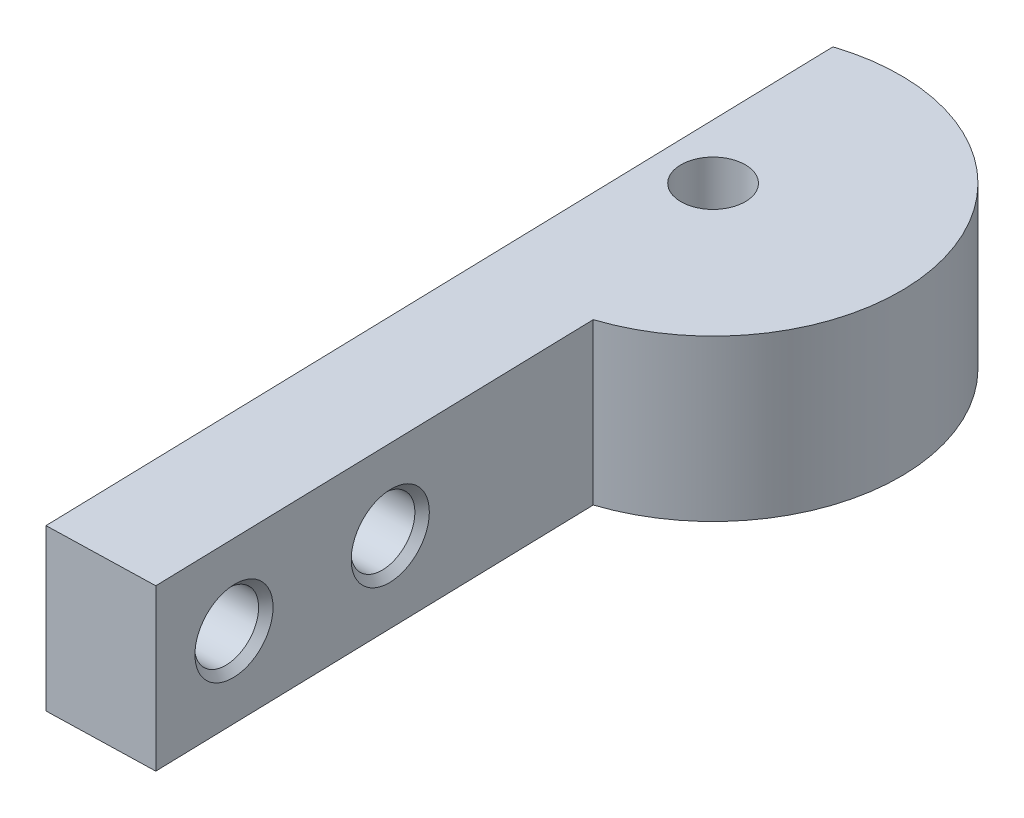
ISO-10303-21;
HEADER;
FILE_DESCRIPTION(('STEP AP214'),'2;1');
FILE_NAME('part.step','',(''),(''),'','','');
FILE_SCHEMA(('AUTOMOTIVE_DESIGN { 1 0 10303 214 1 1 1 1 }'));
ENDSEC;
DATA;
#1=APPLICATION_CONTEXT('core data for automotive mechanical design processes');
#2=APPLICATION_PROTOCOL_DEFINITION('international standard','automotive_design',2000,#1);
#3=PRODUCT_CONTEXT('',#1,'mechanical');
#4=PRODUCT('Part','Part','',(#3));
#5=PRODUCT_RELATED_PRODUCT_CATEGORY('part','',(#4));
#6=PRODUCT_DEFINITION_FORMATION('','',#4);
#7=PRODUCT_DEFINITION_CONTEXT('part definition',#1,'design');
#8=PRODUCT_DEFINITION('design','',#6,#7);
#9=PRODUCT_DEFINITION_SHAPE('','',#8);
#10=(LENGTH_UNIT() NAMED_UNIT(*) SI_UNIT(.MILLI.,.METRE.));
#11=(NAMED_UNIT(*) PLANE_ANGLE_UNIT() SI_UNIT($,.RADIAN.));
#12=(NAMED_UNIT(*) SI_UNIT($,.STERADIAN.) SOLID_ANGLE_UNIT());
#13=UNCERTAINTY_MEASURE_WITH_UNIT(LENGTH_MEASURE(1.E-05),#10,'distance_accuracy_value','');
#14=(GEOMETRIC_REPRESENTATION_CONTEXT(3) GLOBAL_UNCERTAINTY_ASSIGNED_CONTEXT((#13)) GLOBAL_UNIT_ASSIGNED_CONTEXT((#10,
#11,#12)) REPRESENTATION_CONTEXT('',''));
#15=CARTESIAN_POINT('',(0.,0.,0.));
#16=DIRECTION('',(0.,0.,1.));
#17=DIRECTION('',(1.,0.,0.));
#18=AXIS2_PLACEMENT_3D('',#15,#16,#17);
#19=CARTESIAN_POINT('',(-8.62111959957874,0.,61.9426773155297));
#20=DIRECTION('',(0.999657324975557,0.,-0.026176948307873));
#21=DIRECTION('',(-0.026176948307873,0.,-0.999657324975557));
#22=AXIS2_PLACEMENT_3D('',#19,#20,#21);
#23=CONICAL_SURFACE('',#22,1.49999999997588,0.78539816338936);
#24=CARTESIAN_POINT('',(-8.62111959957596,0.,61.9426773155297));
#25=DIRECTION('',(0.999657324975557,0.,-0.026176948307873));
#26=DIRECTION('',(-0.026176948307873,0.,-0.999657324975557));
#27=AXIS2_PLACEMENT_3D('',#24,#25,#26);
#28=CIRCLE('',#27,1.49999999997866);
#29=CARTESIAN_POINT('',(-8.66038502203721,0.,60.4431913280877));
#30=VERTEX_POINT('',#29);
#31=EDGE_CURVE('E19',#30,#30,#28,.F.);
#32=ORIENTED_EDGE('',*,*,#31,.F.);
#33=EDGE_LOOP('',(#32));
#34=FACE_BOUND('',#33,.T.);
#35=CARTESIAN_POINT('',(-8.89102707732812,0.,61.949745091573));
#36=DIRECTION('',(-0.999657324975557,0.,0.0261769483078733));
#37=DIRECTION('',(0.0261769483078733,0.,0.999657324975557));
#38=AXIS2_PLACEMENT_3D('',#35,#36,#37);
#39=CIRCLE('',#38,1.23);
#40=CARTESIAN_POINT('',(-8.85882943090944,0.,63.1793236012929));
#41=VERTEX_POINT('',#40);
#42=EDGE_CURVE('E125',#41,#41,#39,.T.);
#43=ORIENTED_EDGE('',*,*,#42,.T.);
#44=EDGE_LOOP('',(#43));
#45=FACE_BOUND('',#44,.T.);
#46=ADVANCED_FACE('F16',(#34,#45),#23,.F.);
#47=CARTESIAN_POINT('',(-8.46405790968731,0.,67.9406212653819));
#48=DIRECTION('',(0.999657324975557,0.,-0.0261769483078739));
#49=DIRECTION('',(-0.0261769483078739,0.,-0.999657324975557));
#50=AXIS2_PLACEMENT_3D('',#47,#48,#49);
#51=CONICAL_SURFACE('',#50,1.50000000002012,0.78539816338937);
#52=CARTESIAN_POINT('',(-8.46405790968304,0.,67.9406212653818));
#53=DIRECTION('',(0.999657324975557,0.,-0.0261769483078739));
#54=DIRECTION('',(-0.0261769483078739,0.,-0.999657324975557));
#55=AXIS2_PLACEMENT_3D('',#52,#53,#54);
#56=CIRCLE('',#55,1.50000000002439);
#57=CARTESIAN_POINT('',(-8.50332333214549,0.,66.441135277894));
#58=VERTEX_POINT('',#57);
#59=EDGE_CURVE('E127',#58,#58,#56,.F.);
#60=ORIENTED_EDGE('',*,*,#59,.F.);
#61=EDGE_LOOP('',(#60));
#62=FACE_BOUND('',#61,.T.);
#63=CARTESIAN_POINT('',(-8.73396538748088,0.,67.9476890414263));
#64=DIRECTION('',(-0.999657324975557,0.,0.0261769483078733));
#65=DIRECTION('',(0.0261769483078733,0.,0.999657324975557));
#66=AXIS2_PLACEMENT_3D('',#63,#64,#65);
#67=CIRCLE('',#66,1.22999999999999);
#68=CARTESIAN_POINT('',(-8.7017677410622,0.,69.1772675511462));
#69=VERTEX_POINT('',#68);
#70=EDGE_CURVE('E111',#69,#69,#67,.T.);
#71=ORIENTED_EDGE('',*,*,#70,.T.);
#72=EDGE_LOOP('',(#71));
#73=FACE_BOUND('',#72,.T.);
#74=ADVANCED_FACE('F143',(#62,#73),#51,.F.);
#75=CARTESIAN_POINT('',(-11.,5.,47.5));
#76=DIRECTION('',(0.,-1.,0.));
#77=DIRECTION('',(0.,0.,-1.));
#78=AXIS2_PLACEMENT_3D('',#75,#76,#77);
#79=CYLINDRICAL_SURFACE('',#78,1.2);
#80=CARTESIAN_POINT('',(-11.,-3.,47.5));
#81=DIRECTION('',(0.,-1.,0.));
#82=DIRECTION('',(0.,0.,-1.));
#83=AXIS2_PLACEMENT_3D('',#80,#81,#82);
#84=CIRCLE('',#83,1.2);
#85=CARTESIAN_POINT('',(-11.,-3.,46.3));
#86=VERTEX_POINT('',#85);
#87=EDGE_CURVE('E105',#86,#86,#84,.T.);
#88=ORIENTED_EDGE('',*,*,#87,.T.);
#89=EDGE_LOOP('',(#88));
#90=FACE_BOUND('',#89,.T.);
#91=CARTESIAN_POINT('',(-11.,3.,47.5));
#92=DIRECTION('',(0.,-1.,0.));
#93=DIRECTION('',(0.,0.,-1.));
#94=AXIS2_PLACEMENT_3D('',#91,#92,#93);
#95=CIRCLE('',#94,1.2);
#96=CARTESIAN_POINT('',(-11.,3.,46.3));
#97=VERTEX_POINT('',#96);
#98=EDGE_CURVE('E81',#97,#97,#95,.T.);
#99=ORIENTED_EDGE('',*,*,#98,.F.);
#100=EDGE_LOOP('',(#99));
#101=FACE_BOUND('',#100,.T.);
#102=ADVANCED_FACE('F187',(#90,#101),#79,.F.);
#103=CARTESIAN_POINT('',(-8.38552706481387,3.,70.9395932403098));
#104=DIRECTION('',(0.999657324975557,0.,-0.0261769483078732));
#105=DIRECTION('',(-0.0261769483078732,0.,-0.999657324975557));
#106=AXIS2_PLACEMENT_3D('',#103,#104,#105);
#107=PLANE('',#106);
#108=ORIENTED_EDGE('',*,*,#59,.T.);
#109=EDGE_LOOP('',(#108));
#110=FACE_BOUND('',#109,.T.);
#111=ORIENTED_EDGE('',*,*,#31,.T.);
#112=EDGE_LOOP('',(#111));
#113=FACE_BOUND('',#112,.T.);
#114=DIRECTION('',(-0.0261769483078732,0.,-0.999657324975557));
#115=VECTOR('',#114,1.);
#116=CARTESIAN_POINT('',(-8.38552706481387,3.,70.9395932403098));
#117=LINE('',#116,#115);
#118=CARTESIAN_POINT('',(-8.38552706481387,3.,70.9395932403098));
#119=VERTEX_POINT('',#118);
#120=CARTESIAN_POINT('',(-8.82508504246918,3.,54.1535513019371));
#121=VERTEX_POINT('',#120);
#122=EDGE_CURVE('E98',#119,#121,#117,.T.);
#123=ORIENTED_EDGE('',*,*,#122,.F.);
#124=DIRECTION('',(0.,1.,0.));
#125=VECTOR('',#124,1.);
#126=CARTESIAN_POINT('',(-8.38552706481387,3.,70.9395932403098));
#127=LINE('',#126,#125);
#128=CARTESIAN_POINT('',(-8.38552706481387,-3.,70.9395932403098));
#129=VERTEX_POINT('',#128);
#130=EDGE_CURVE('E57',#129,#119,#127,.T.);
#131=ORIENTED_EDGE('',*,*,#130,.F.);
#132=DIRECTION('',(-0.0261769483078732,0.,-0.999657324975557));
#133=VECTOR('',#132,1.);
#134=CARTESIAN_POINT('',(-8.38552706481387,-3.,70.9395932403098));
#135=LINE('',#134,#133);
#136=CARTESIAN_POINT('',(-8.82508504246918,-3.,54.1535513019371));
#137=VERTEX_POINT('',#136);
#138=EDGE_CURVE('E51',#129,#137,#135,.T.);
#139=ORIENTED_EDGE('',*,*,#138,.T.);
#140=DIRECTION('',(0.,-1.,0.));
#141=VECTOR('',#140,1.);
#142=CARTESIAN_POINT('',(-8.82508504246918,3.,54.1535513019371));
#143=LINE('',#142,#141);
#144=EDGE_CURVE('E80',#121,#137,#143,.T.);
#145=ORIENTED_EDGE('',*,*,#144,.F.);
#146=EDGE_LOOP('',(#123,#131,#139,#145));
#147=FACE_BOUND('',#146,.T.);
#148=ADVANCED_FACE('F139',(#110,#113,#147),#107,.T.);
#149=CARTESIAN_POINT('',(-10.6204342495358,0.,61.9950312121456));
#150=DIRECTION('',(-0.999657324975557,0.,0.0261769483078733));
#151=DIRECTION('',(0.0261769483078733,0.,0.999657324975557));
#152=AXIS2_PLACEMENT_3D('',#149,#150,#151);
#153=CYLINDRICAL_SURFACE('',#152,1.23);
#154=ORIENTED_EDGE('',*,*,#42,.F.);
#155=EDGE_LOOP('',(#154));
#156=FACE_BOUND('',#155,.T.);
#157=CARTESIAN_POINT('',(-12.3498414217833,0.,62.0403173327192));
#158=DIRECTION('',(-0.999657324975557,0.,0.0261769483078733));
#159=DIRECTION('',(-0.0261769483078726,0.,-0.999657324975557));
#160=AXIS2_PLACEMENT_3D('',#157,#158,#159);
#161=CIRCLE('',#160,1.22999999992009);
#162=CARTESIAN_POINT('',(-12.3820390681999,0.,60.8107388230792));
#163=VERTEX_POINT('',#162);
#164=EDGE_CURVE('E116',#163,#163,#161,.T.);
#165=ORIENTED_EDGE('',*,*,#164,.T.);
#166=EDGE_LOOP('',(#165));
#167=FACE_BOUND('',#166,.T.);
#168=ADVANCED_FACE('F146',(#156,#167),#153,.F.);
#169=CARTESIAN_POINT('',(-10.4633725596886,0.,67.9929751619989));
#170=DIRECTION('',(-0.999657324975557,0.,0.0261769483078733));
#171=DIRECTION('',(0.0261769483078733,0.,0.999657324975557));
#172=AXIS2_PLACEMENT_3D('',#169,#170,#171);
#173=CYLINDRICAL_SURFACE('',#172,1.22999999999999);
#174=ORIENTED_EDGE('',*,*,#70,.F.);
#175=EDGE_LOOP('',(#174));
#176=FACE_BOUND('',#175,.T.);
#177=CARTESIAN_POINT('',(-12.1927797319487,0.,68.038261282573));
#178=DIRECTION('',(-0.999657324975557,0.,0.0261769483078733));
#179=DIRECTION('',(-0.0261769483078731,0.,-0.999657324975557));
#180=AXIS2_PLACEMENT_3D('',#177,#178,#179);
#181=CIRCLE('',#180,1.22999999996592);
#182=CARTESIAN_POINT('',(-12.2249773783665,0.,66.8086827728871));
#183=VERTEX_POINT('',#182);
#184=EDGE_CURVE('E74',#183,#183,#181,.T.);
#185=ORIENTED_EDGE('',*,*,#184,.T.);
#186=EDGE_LOOP('',(#185));
#187=FACE_BOUND('',#186,.T.);
#188=ADVANCED_FACE('F149',(#176,#187),#173,.F.);
#189=CARTESIAN_POINT('',(0.,-3.,0.));
#190=DIRECTION('',(0.,1.,0.));
#191=DIRECTION('',(0.,0.,1.));
#192=AXIS2_PLACEMENT_3D('',#189,#190,#191);
#193=PLANE('',#192);
#194=ORIENTED_EDGE('',*,*,#87,.F.);
#195=EDGE_LOOP('',(#194));
#196=FACE_BOUND('',#195,.T.);
#197=DIRECTION('',(0.0261769483078731,0.,0.999657324975557));
#198=VECTOR('',#197,1.);
#199=CARTESIAN_POINT('',(-13.1749149575308,-3.,40.8464486980629));
#200=LINE('',#199,#198);
#201=CARTESIAN_POINT('',(-13.1749149575308,-3.,40.8464486980629));
#202=VERTEX_POINT('',#201);
#203=CARTESIAN_POINT('',(-12.3841563647161,-3.,71.0443010335413));
#204=VERTEX_POINT('',#203);
#205=EDGE_CURVE('E65',#202,#204,#200,.T.);
#206=ORIENTED_EDGE('',*,*,#205,.F.);
#207=CARTESIAN_POINT('',(-11.,-3.,47.5));
#208=DIRECTION('',(0.,-1.,0.));
#209=DIRECTION('',(0.,0.,-1.));
#210=AXIS2_PLACEMENT_3D('',#207,#208,#209);
#211=CIRCLE('',#210,7.);
#212=EDGE_CURVE('E68',#137,#202,#211,.F.);
#213=ORIENTED_EDGE('',*,*,#212,.F.);
#214=ORIENTED_EDGE('',*,*,#138,.F.);
#215=DIRECTION('',(0.999657324975557,0.,-0.0261769483078744));
#216=VECTOR('',#215,1.);
#217=CARTESIAN_POINT('',(-12.3841563647161,-3.,71.0443010335413));
#218=LINE('',#217,#216);
#219=EDGE_CURVE('E62',#204,#129,#218,.T.);
#220=ORIENTED_EDGE('',*,*,#219,.F.);
#221=EDGE_LOOP('',(#206,#213,#214,#220));
#222=FACE_BOUND('',#221,.T.);
#223=ADVANCED_FACE('F67',(#196,#222),#193,.F.);
#224=CARTESIAN_POINT('',(-12.3841563647161,3.,71.0443010335413));
#225=DIRECTION('',(0.0261769483078744,0.,0.999657324975557));
#226=DIRECTION('',(0.999657324975557,0.,-0.0261769483078744));
#227=AXIS2_PLACEMENT_3D('',#224,#225,#226);
#228=PLANE('',#227);
#229=DIRECTION('',(0.999657324975557,0.,-0.0261769483078725));
#230=VECTOR('',#229,1.);
#231=CARTESIAN_POINT('',(-12.3841563647161,3.,71.0443010335413));
#232=LINE('',#231,#230);
#233=CARTESIAN_POINT('',(-12.3841563647161,3.,71.0443010335413));
#234=VERTEX_POINT('',#233);
#235=EDGE_CURVE('E95',#234,#119,#232,.T.);
#236=ORIENTED_EDGE('',*,*,#235,.F.);
#237=DIRECTION('',(0.,1.,0.));
#238=VECTOR('',#237,1.);
#239=CARTESIAN_POINT('',(-12.3841563647161,3.,71.0443010335413));
#240=LINE('',#239,#238);
#241=EDGE_CURVE('E73',#204,#234,#240,.T.);
#242=ORIENTED_EDGE('',*,*,#241,.F.);
#243=ORIENTED_EDGE('',*,*,#219,.T.);
#244=ORIENTED_EDGE('',*,*,#130,.T.);
#245=EDGE_LOOP('',(#236,#242,#243,#244));
#246=FACE_BOUND('',#245,.T.);
#247=ADVANCED_FACE('F175',(#246),#228,.T.);
#248=CARTESIAN_POINT('',(0.,3.,0.));
#249=DIRECTION('',(0.,1.,0.));
#250=DIRECTION('',(0.,0.,1.));
#251=AXIS2_PLACEMENT_3D('',#248,#249,#250);
#252=PLANE('',#251);
#253=ORIENTED_EDGE('',*,*,#98,.T.);
#254=EDGE_LOOP('',(#253));
#255=FACE_BOUND('',#254,.T.);
#256=ORIENTED_EDGE('',*,*,#122,.T.);
#257=CARTESIAN_POINT('',(-11.,3.,47.5));
#258=DIRECTION('',(0.,-1.,0.));
#259=DIRECTION('',(0.,0.,-1.));
#260=AXIS2_PLACEMENT_3D('',#257,#258,#259);
#261=CIRCLE('',#260,7.);
#262=CARTESIAN_POINT('',(-13.1749149575308,3.,40.8464486980629));
#263=VERTEX_POINT('',#262);
#264=EDGE_CURVE('E34',#263,#121,#261,.T.);
#265=ORIENTED_EDGE('',*,*,#264,.F.);
#266=DIRECTION('',(0.0261769483078731,0.,0.999657324975557));
#267=VECTOR('',#266,1.);
#268=CARTESIAN_POINT('',(-13.1749149575308,3.,40.8464486980629));
#269=LINE('',#268,#267);
#270=EDGE_CURVE('E84',#234,#263,#269,.F.);
#271=ORIENTED_EDGE('',*,*,#270,.F.);
#272=ORIENTED_EDGE('',*,*,#235,.T.);
#273=EDGE_LOOP('',(#256,#265,#271,#272));
#274=FACE_BOUND('',#273,.T.);
#275=ADVANCED_FACE('F172',(#255,#274),#252,.T.);
#276=CARTESIAN_POINT('',(-11.,3.,47.5));
#277=DIRECTION('',(0.,-1.,0.));
#278=DIRECTION('',(0.,0.,-1.));
#279=AXIS2_PLACEMENT_3D('',#276,#277,#278);
#280=CYLINDRICAL_SURFACE('',#279,7.);
#281=ORIENTED_EDGE('',*,*,#264,.T.);
#282=ORIENTED_EDGE('',*,*,#144,.T.);
#283=ORIENTED_EDGE('',*,*,#212,.T.);
#284=DIRECTION('',(0.,1.,0.));
#285=VECTOR('',#284,1.);
#286=CARTESIAN_POINT('',(-13.1749149575308,3.,40.8464486980629));
#287=LINE('',#286,#285);
#288=EDGE_CURVE('E78',#263,#202,#287,.F.);
#289=ORIENTED_EDGE('',*,*,#288,.F.);
#290=EDGE_LOOP('',(#281,#282,#283,#289));
#291=FACE_BOUND('',#290,.T.);
#292=ADVANCED_FACE('F77',(#291),#280,.T.);
#293=CARTESIAN_POINT('',(-12.6197488995078,0.,62.0473851087619));
#294=DIRECTION('',(-0.999657324975557,0.,0.0261769483078738));
#295=DIRECTION('',(0.0261769483078738,0.,0.999657324975557));
#296=AXIS2_PLACEMENT_3D('',#293,#294,#295);
#297=CONICAL_SURFACE('',#296,1.49999999996679,0.785398163524541);
#298=ORIENTED_EDGE('',*,*,#164,.F.);
#299=EDGE_LOOP('',(#298));
#300=FACE_BOUND('',#299,.T.);
#301=CARTESIAN_POINT('',(-12.6197488994585,0.,62.0473851087606));
#302=DIRECTION('',(-0.999657324975557,0.,0.0261769483078738));
#303=DIRECTION('',(0.0261769483078738,0.,0.999657324975557));
#304=AXIS2_PLACEMENT_3D('',#301,#302,#303);
#305=CIRCLE('',#304,1.49999999991752);
#306=CARTESIAN_POINT('',(-12.5804834769989,0.,63.5468710961415));
#307=VERTEX_POINT('',#306);
#308=EDGE_CURVE('E25',#307,#307,#305,.F.);
#309=ORIENTED_EDGE('',*,*,#308,.F.);
#310=EDGE_LOOP('',(#309));
#311=FACE_BOUND('',#310,.T.);
#312=ADVANCED_FACE('F153',(#300,#311),#297,.F.);
#313=CARTESIAN_POINT('',(-12.4626872097853,0.,68.0453290586185));
#314=DIRECTION('',(-0.999657324975557,0.,0.0261769483078719));
#315=DIRECTION('',(0.0261769483078719,0.,0.999657324975557));
#316=AXIS2_PLACEMENT_3D('',#313,#314,#315);
#317=CONICAL_SURFACE('',#316,1.50000000007243,0.785398163422064);
#318=ORIENTED_EDGE('',*,*,#184,.F.);
#319=EDGE_LOOP('',(#318));
#320=FACE_BOUND('',#319,.T.);
#321=CARTESIAN_POINT('',(-12.4626872096872,0.,68.045329058616));
#322=DIRECTION('',(-0.999657324975557,0.,0.0261769483078719));
#323=DIRECTION('',(0.0261769483078719,0.,0.999657324975557));
#324=AXIS2_PLACEMENT_3D('',#321,#322,#323);
#325=CIRCLE('',#324,1.49999999997434);
#326=CARTESIAN_POINT('',(-12.4234217872261,0.,69.5448150460537));
#327=VERTEX_POINT('',#326);
#328=EDGE_CURVE('E11',#327,#327,#325,.F.);
#329=ORIENTED_EDGE('',*,*,#328,.F.);
#330=EDGE_LOOP('',(#329));
#331=FACE_BOUND('',#330,.T.);
#332=ADVANCED_FACE('F156',(#320,#331),#317,.F.);
#333=CARTESIAN_POINT('',(-13.1749149575308,3.,40.8464486980629));
#334=DIRECTION('',(-0.999657324975557,0.,0.0261769483078731));
#335=DIRECTION('',(0.0261769483078731,0.,0.999657324975557));
#336=AXIS2_PLACEMENT_3D('',#333,#334,#335);
#337=PLANE('',#336);
#338=ORIENTED_EDGE('',*,*,#328,.T.);
#339=EDGE_LOOP('',(#338));
#340=FACE_BOUND('',#339,.T.);
#341=ORIENTED_EDGE('',*,*,#308,.T.);
#342=EDGE_LOOP('',(#341));
#343=FACE_BOUND('',#342,.T.);
#344=ORIENTED_EDGE('',*,*,#270,.T.);
#345=ORIENTED_EDGE('',*,*,#288,.T.);
#346=ORIENTED_EDGE('',*,*,#205,.T.);
#347=ORIENTED_EDGE('',*,*,#241,.T.);
#348=EDGE_LOOP('',(#344,#345,#346,#347));
#349=FACE_BOUND('',#348,.T.);
#350=ADVANCED_FACE('F83',(#340,#343,#349),#337,.T.);
#351=CLOSED_SHELL('',(#46,#74,#102,#148,#168,#188,#223,#247,#275,#292,#312,#332,#350));
#352=MANIFOLD_SOLID_BREP('B1',#351);
#353=ADVANCED_BREP_SHAPE_REPRESENTATION('',(#18,#352),#14);
#354=SHAPE_DEFINITION_REPRESENTATION(#9,#353);
ENDSEC;
END-ISO-10303-21;
